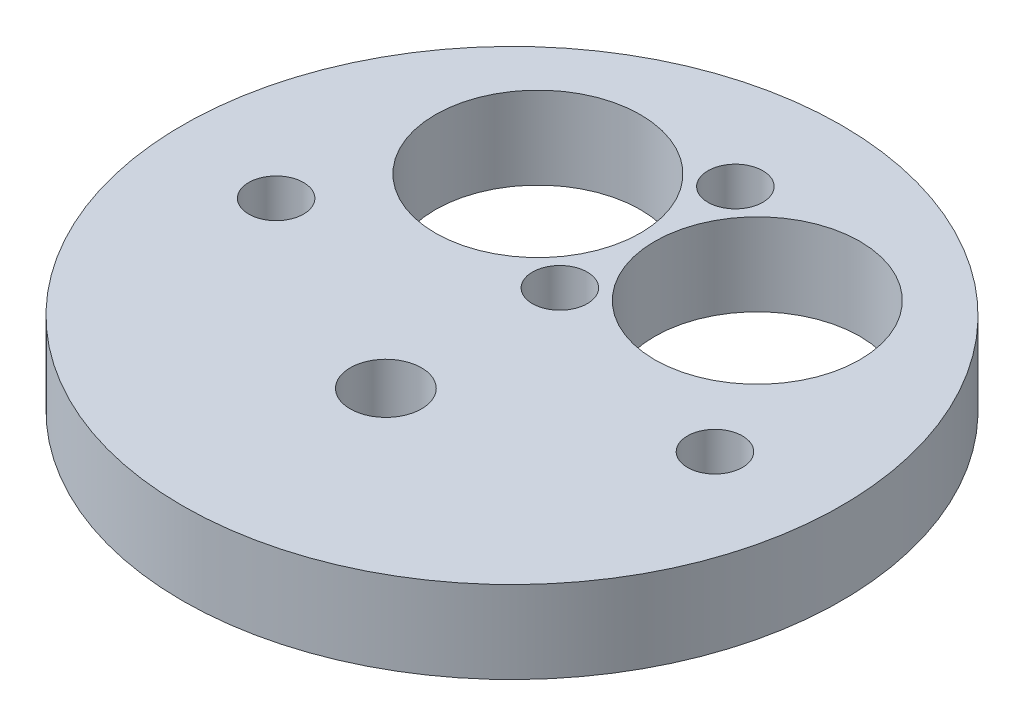
ISO-10303-21;
HEADER;
FILE_DESCRIPTION(('STEP AP214'),'2;1');
FILE_NAME('part.step','',(''),(''),'','','');
FILE_SCHEMA(('AUTOMOTIVE_DESIGN { 1 0 10303 214 1 1 1 1 }'));
ENDSEC;
DATA;
#1=APPLICATION_CONTEXT('core data for automotive mechanical design processes');
#2=APPLICATION_PROTOCOL_DEFINITION('international standard','automotive_design',2000,#1);
#3=PRODUCT_CONTEXT('',#1,'mechanical');
#4=PRODUCT('Part','Part','',(#3));
#5=PRODUCT_RELATED_PRODUCT_CATEGORY('part','',(#4));
#6=PRODUCT_DEFINITION_FORMATION('','',#4);
#7=PRODUCT_DEFINITION_CONTEXT('part definition',#1,'design');
#8=PRODUCT_DEFINITION('design','',#6,#7);
#9=PRODUCT_DEFINITION_SHAPE('','',#8);
#10=(LENGTH_UNIT() NAMED_UNIT(*) SI_UNIT(.MILLI.,.METRE.));
#11=(NAMED_UNIT(*) PLANE_ANGLE_UNIT() SI_UNIT($,.RADIAN.));
#12=(NAMED_UNIT(*) SI_UNIT($,.STERADIAN.) SOLID_ANGLE_UNIT());
#13=UNCERTAINTY_MEASURE_WITH_UNIT(LENGTH_MEASURE(1.E-05),#10,'distance_accuracy_value','');
#14=(GEOMETRIC_REPRESENTATION_CONTEXT(3) GLOBAL_UNCERTAINTY_ASSIGNED_CONTEXT((#13)) GLOBAL_UNIT_ASSIGNED_CONTEXT((#10,
#11,#12)) REPRESENTATION_CONTEXT('',''));
#15=CARTESIAN_POINT('',(0.,0.,0.));
#16=DIRECTION('',(0.,0.,1.));
#17=DIRECTION('',(1.,0.,0.));
#18=AXIS2_PLACEMENT_3D('',#15,#16,#17);
#19=CARTESIAN_POINT('',(0.,0.,0.));
#20=DIRECTION('',(0.,-1.,0.));
#21=DIRECTION('',(0.,0.,-1.));
#22=AXIS2_PLACEMENT_3D('',#19,#20,#21);
#23=PLANE('',#22);
#24=CARTESIAN_POINT('',(-25.4,0.,1.905));
#25=DIRECTION('',(0.,1.,0.));
#26=DIRECTION('',(0.,0.,1.));
#27=AXIS2_PLACEMENT_3D('',#24,#25,#26);
#28=CIRCLE('',#27,3.175);
#29=CARTESIAN_POINT('',(-25.4,0.,5.08));
#30=VERTEX_POINT('',#29);
#31=EDGE_CURVE('E119',#30,#30,#28,.T.);
#32=ORIENTED_EDGE('',*,*,#31,.T.);
#33=EDGE_LOOP('',(#32));
#34=FACE_BOUND('',#33,.T.);
#35=CARTESIAN_POINT('',(25.4,0.,1.90499999999999));
#36=DIRECTION('',(0.,1.,0.));
#37=DIRECTION('',(0.,0.,1.));
#38=AXIS2_PLACEMENT_3D('',#35,#36,#37);
#39=CIRCLE('',#38,3.175);
#40=CARTESIAN_POINT('',(25.4,0.,5.07999999999999));
#41=VERTEX_POINT('',#40);
#42=EDGE_CURVE('E123',#41,#41,#39,.T.);
#43=ORIENTED_EDGE('',*,*,#42,.T.);
#44=EDGE_LOOP('',(#43));
#45=FACE_BOUND('',#44,.T.);
#46=CARTESIAN_POINT('',(0.,0.,-25.85927542914));
#47=DIRECTION('',(0.,1.,0.));
#48=DIRECTION('',(0.,0.,1.));
#49=AXIS2_PLACEMENT_3D('',#46,#47,#48);
#50=CIRCLE('',#49,3.175);
#51=CARTESIAN_POINT('',(0.,0.,-22.68427542914));
#52=VERTEX_POINT('',#51);
#53=EDGE_CURVE('E136',#52,#52,#50,.T.);
#54=ORIENTED_EDGE('',*,*,#53,.T.);
#55=EDGE_LOOP('',(#54));
#56=FACE_BOUND('',#55,.T.);
#57=CARTESIAN_POINT('',(12.7,0.,-15.69927542914));
#58=DIRECTION('',(0.,1.,0.));
#59=DIRECTION('',(0.,0.,1.));
#60=AXIS2_PLACEMENT_3D('',#57,#58,#59);
#61=CIRCLE('',#60,11.8745);
#62=CARTESIAN_POINT('',(12.7,0.,-3.82477542914004));
#63=VERTEX_POINT('',#62);
#64=EDGE_CURVE('E141',#63,#63,#61,.T.);
#65=ORIENTED_EDGE('',*,*,#64,.T.);
#66=EDGE_LOOP('',(#65));
#67=FACE_BOUND('',#66,.T.);
#68=CARTESIAN_POINT('',(0.,0.,-5.53927542914004));
#69=DIRECTION('',(0.,1.,0.));
#70=DIRECTION('',(0.,0.,1.));
#71=AXIS2_PLACEMENT_3D('',#68,#69,#70);
#72=CIRCLE('',#71,3.175);
#73=CARTESIAN_POINT('',(0.,0.,-2.36427542914004));
#74=VERTEX_POINT('',#73);
#75=EDGE_CURVE('E133',#74,#74,#72,.T.);
#76=ORIENTED_EDGE('',*,*,#75,.T.);
#77=EDGE_LOOP('',(#76));
#78=FACE_BOUND('',#77,.T.);
#79=CARTESIAN_POINT('',(0.,0.,14.605));
#80=DIRECTION('',(0.,1.,0.));
#81=DIRECTION('',(0.,0.,1.));
#82=AXIS2_PLACEMENT_3D('',#79,#80,#81);
#83=CIRCLE('',#82,4.1275);
#84=CARTESIAN_POINT('',(0.,0.,18.7325));
#85=VERTEX_POINT('',#84);
#86=EDGE_CURVE('E125',#85,#85,#83,.T.);
#87=ORIENTED_EDGE('',*,*,#86,.T.);
#88=EDGE_LOOP('',(#87));
#89=FACE_BOUND('',#88,.T.);
#90=CARTESIAN_POINT('',(-12.7,0.,-15.69927542914));
#91=DIRECTION('',(0.,1.,0.));
#92=DIRECTION('',(0.,0.,1.));
#93=AXIS2_PLACEMENT_3D('',#90,#91,#92);
#94=CIRCLE('',#93,11.8745);
#95=CARTESIAN_POINT('',(-12.7,0.,-3.82477542914003));
#96=VERTEX_POINT('',#95);
#97=EDGE_CURVE('E53',#96,#96,#94,.T.);
#98=ORIENTED_EDGE('',*,*,#97,.T.);
#99=EDGE_LOOP('',(#98));
#100=FACE_BOUND('',#99,.T.);
#101=CARTESIAN_POINT('',(0.,0.,0.));
#102=DIRECTION('',(0.,-1.,0.));
#103=DIRECTION('',(0.,0.,-1.));
#104=AXIS2_PLACEMENT_3D('',#101,#102,#103);
#105=CIRCLE('',#104,38.1508);
#106=CARTESIAN_POINT('',(0.,0.,-38.1508));
#107=VERTEX_POINT('',#106);
#108=EDGE_CURVE('E10',#107,#107,#105,.T.);
#109=ORIENTED_EDGE('',*,*,#108,.T.);
#110=EDGE_LOOP('',(#109));
#111=FACE_BOUND('',#110,.T.);
#112=ADVANCED_FACE('F34',(#34,#45,#56,#67,#78,#89,#100,#111),#23,.T.);
#113=CARTESIAN_POINT('',(0.,0.,0.));
#114=DIRECTION('',(0.,-1.,0.));
#115=DIRECTION('',(0.,0.,-1.));
#116=AXIS2_PLACEMENT_3D('',#113,#114,#115);
#117=CYLINDRICAL_SURFACE('',#116,38.1508);
#118=CARTESIAN_POINT('',(0.,9.525,0.));
#119=DIRECTION('',(0.,-1.,0.));
#120=DIRECTION('',(0.,0.,-1.));
#121=AXIS2_PLACEMENT_3D('',#118,#119,#120);
#122=CIRCLE('',#121,38.1508);
#123=CARTESIAN_POINT('',(0.,9.525,-38.1508));
#124=VERTEX_POINT('',#123);
#125=EDGE_CURVE('E41',#124,#124,#122,.T.);
#126=ORIENTED_EDGE('',*,*,#125,.T.);
#127=EDGE_LOOP('',(#126));
#128=FACE_BOUND('',#127,.T.);
#129=ORIENTED_EDGE('',*,*,#108,.F.);
#130=EDGE_LOOP('',(#129));
#131=FACE_BOUND('',#130,.T.);
#132=ADVANCED_FACE('F72',(#128,#131),#117,.T.);
#133=CARTESIAN_POINT('',(38.1508,9.525,0.));
#134=DIRECTION('',(0.,1.,0.));
#135=DIRECTION('',(0.,0.,1.));
#136=AXIS2_PLACEMENT_3D('',#133,#134,#135);
#137=PLANE('',#136);
#138=CARTESIAN_POINT('',(-25.4,9.525,1.905));
#139=DIRECTION('',(0.,1.,0.));
#140=DIRECTION('',(0.,0.,1.));
#141=AXIS2_PLACEMENT_3D('',#138,#139,#140);
#142=CIRCLE('',#141,3.175);
#143=CARTESIAN_POINT('',(-25.4,9.52499999999999,5.08));
#144=VERTEX_POINT('',#143);
#145=EDGE_CURVE('E122',#144,#144,#142,.T.);
#146=ORIENTED_EDGE('',*,*,#145,.F.);
#147=EDGE_LOOP('',(#146));
#148=FACE_BOUND('',#147,.T.);
#149=CARTESIAN_POINT('',(25.4,9.525,1.90499999999999));
#150=DIRECTION('',(0.,1.,0.));
#151=DIRECTION('',(0.,0.,1.));
#152=AXIS2_PLACEMENT_3D('',#149,#150,#151);
#153=CIRCLE('',#152,3.175);
#154=CARTESIAN_POINT('',(25.4,9.52499999999999,5.07999999999999));
#155=VERTEX_POINT('',#154);
#156=EDGE_CURVE('E128',#155,#155,#153,.T.);
#157=ORIENTED_EDGE('',*,*,#156,.F.);
#158=EDGE_LOOP('',(#157));
#159=FACE_BOUND('',#158,.T.);
#160=CARTESIAN_POINT('',(0.,9.525,-25.85927542914));
#161=DIRECTION('',(0.,1.,0.));
#162=DIRECTION('',(0.,0.,1.));
#163=AXIS2_PLACEMENT_3D('',#160,#161,#162);
#164=CIRCLE('',#163,3.175);
#165=CARTESIAN_POINT('',(0.,9.52499999999999,-22.68427542914));
#166=VERTEX_POINT('',#165);
#167=EDGE_CURVE('E37',#166,#166,#164,.T.);
#168=ORIENTED_EDGE('',*,*,#167,.F.);
#169=EDGE_LOOP('',(#168));
#170=FACE_BOUND('',#169,.T.);
#171=CARTESIAN_POINT('',(12.7,9.525,-15.69927542914));
#172=DIRECTION('',(0.,1.,0.));
#173=DIRECTION('',(0.,0.,1.));
#174=AXIS2_PLACEMENT_3D('',#171,#172,#173);
#175=CIRCLE('',#174,11.8745);
#176=CARTESIAN_POINT('',(12.7,9.52499999999999,-3.82477542914004));
#177=VERTEX_POINT('',#176);
#178=EDGE_CURVE('E58',#177,#177,#175,.T.);
#179=ORIENTED_EDGE('',*,*,#178,.F.);
#180=EDGE_LOOP('',(#179));
#181=FACE_BOUND('',#180,.T.);
#182=CARTESIAN_POINT('',(0.,9.525,-5.53927542914004));
#183=DIRECTION('',(0.,1.,0.));
#184=DIRECTION('',(0.,0.,1.));
#185=AXIS2_PLACEMENT_3D('',#182,#183,#184);
#186=CIRCLE('',#185,3.175);
#187=CARTESIAN_POINT('',(0.,9.52499999999999,-2.36427542914004));
#188=VERTEX_POINT('',#187);
#189=EDGE_CURVE('E56',#188,#188,#186,.T.);
#190=ORIENTED_EDGE('',*,*,#189,.F.);
#191=EDGE_LOOP('',(#190));
#192=FACE_BOUND('',#191,.T.);
#193=CARTESIAN_POINT('',(0.,9.525,14.605));
#194=DIRECTION('',(0.,1.,0.));
#195=DIRECTION('',(0.,0.,1.));
#196=AXIS2_PLACEMENT_3D('',#193,#194,#195);
#197=CIRCLE('',#196,4.1275);
#198=CARTESIAN_POINT('',(0.,9.52499999999999,18.7325));
#199=VERTEX_POINT('',#198);
#200=EDGE_CURVE('E52',#199,#199,#197,.T.);
#201=ORIENTED_EDGE('',*,*,#200,.F.);
#202=EDGE_LOOP('',(#201));
#203=FACE_BOUND('',#202,.T.);
#204=CARTESIAN_POINT('',(-12.7,9.525,-15.69927542914));
#205=DIRECTION('',(0.,1.,0.));
#206=DIRECTION('',(0.,0.,1.));
#207=AXIS2_PLACEMENT_3D('',#204,#205,#206);
#208=CIRCLE('',#207,11.8745);
#209=CARTESIAN_POINT('',(-12.7,9.52499999999999,-3.82477542914003));
#210=VERTEX_POINT('',#209);
#211=EDGE_CURVE('E49',#210,#210,#208,.T.);
#212=ORIENTED_EDGE('',*,*,#211,.F.);
#213=EDGE_LOOP('',(#212));
#214=FACE_BOUND('',#213,.T.);
#215=ORIENTED_EDGE('',*,*,#125,.F.);
#216=EDGE_LOOP('',(#215));
#217=FACE_BOUND('',#216,.T.);
#218=ADVANCED_FACE('F68',(#148,#159,#170,#181,#192,#203,#214,#217),#137,.T.);
#219=CARTESIAN_POINT('',(-12.7,0.,-15.69927542914));
#220=DIRECTION('',(0.,1.,0.));
#221=DIRECTION('',(0.,0.,1.));
#222=AXIS2_PLACEMENT_3D('',#219,#220,#221);
#223=CYLINDRICAL_SURFACE('',#222,11.8745);
#224=CARTESIAN_POINT('',(-12.7,9.52499999999999,-3.82477542914003));
#225=CARTESIAN_POINT('',(-12.7,9.42578124999999,-3.82477542914003));
#226=CARTESIAN_POINT('',(-12.7,9.32656249999999,-3.82477542914003));
#227=CARTESIAN_POINT('',(-12.7,9.12812499999999,-3.82477542914003));
#228=CARTESIAN_POINT('',(-12.7,9.02890624999999,-3.82477542914003));
#229=CARTESIAN_POINT('',(-12.7,8.83046874999999,-3.82477542914003));
#230=CARTESIAN_POINT('',(-12.7,8.73124999999999,-3.82477542914003));
#231=CARTESIAN_POINT('',(-12.7,8.5328125,-3.82477542914003));
#232=CARTESIAN_POINT('',(-12.7,8.43359374999999,-3.82477542914003));
#233=CARTESIAN_POINT('',(-12.7,8.23515625,-3.82477542914003));
#234=CARTESIAN_POINT('',(-12.7,8.13593749999999,-3.82477542914003));
#235=CARTESIAN_POINT('',(-12.7,7.93749999999999,-3.82477542914003));
#236=CARTESIAN_POINT('',(-12.7,7.83828125,-3.82477542914003));
#237=CARTESIAN_POINT('',(-12.7,7.63984374999999,-3.82477542914003));
#238=CARTESIAN_POINT('',(-12.7,7.540625,-3.82477542914003));
#239=CARTESIAN_POINT('',(-12.7,7.3421875,-3.82477542914003));
#240=CARTESIAN_POINT('',(-12.7,7.24296874999999,-3.82477542914003));
#241=CARTESIAN_POINT('',(-12.7,7.04453125,-3.82477542914003));
#242=CARTESIAN_POINT('',(-12.7,6.9453125,-3.82477542914003));
#243=CARTESIAN_POINT('',(-12.7,6.746875,-3.82477542914003));
#244=CARTESIAN_POINT('',(-12.7,6.64765625,-3.82477542914003));
#245=CARTESIAN_POINT('',(-12.7,6.44921875,-3.82477542914003));
#246=CARTESIAN_POINT('',(-12.7,6.35,-3.82477542914003));
#247=CARTESIAN_POINT('',(-12.7,6.1515625,-3.82477542914003));
#248=CARTESIAN_POINT('',(-12.7,6.05234375,-3.82477542914003));
#249=CARTESIAN_POINT('',(-12.7,5.85390625,-3.82477542914003));
#250=CARTESIAN_POINT('',(-12.7,5.7546875,-3.82477542914003));
#251=CARTESIAN_POINT('',(-12.7,5.55625,-3.82477542914003));
#252=CARTESIAN_POINT('',(-12.7,5.45703125,-3.82477542914003));
#253=CARTESIAN_POINT('',(-12.7,5.25859375,-3.82477542914003));
#254=CARTESIAN_POINT('',(-12.7,5.159375,-3.82477542914003));
#255=CARTESIAN_POINT('',(-12.7,4.9609375,-3.82477542914003));
#256=CARTESIAN_POINT('',(-12.7,4.86171875,-3.82477542914003));
#257=CARTESIAN_POINT('',(-12.7,4.66328125,-3.82477542914003));
#258=CARTESIAN_POINT('',(-12.7,4.5640625,-3.82477542914003));
#259=CARTESIAN_POINT('',(-12.7,4.365625,-3.82477542914003));
#260=CARTESIAN_POINT('',(-12.7,4.26640625,-3.82477542914003));
#261=CARTESIAN_POINT('',(-12.7,4.06796875,-3.82477542914003));
#262=CARTESIAN_POINT('',(-12.7,3.96875,-3.82477542914003));
#263=CARTESIAN_POINT('',(-12.7,3.7703125,-3.82477542914003));
#264=CARTESIAN_POINT('',(-12.7,3.67109375,-3.82477542914003));
#265=CARTESIAN_POINT('',(-12.7,3.47265625,-3.82477542914003));
#266=CARTESIAN_POINT('',(-12.7,3.3734375,-3.82477542914003));
#267=CARTESIAN_POINT('',(-12.7,3.175,-3.82477542914003));
#268=CARTESIAN_POINT('',(-12.7,3.07578125,-3.82477542914003));
#269=CARTESIAN_POINT('',(-12.7,2.87734375,-3.82477542914003));
#270=CARTESIAN_POINT('',(-12.7,2.778125,-3.82477542914003));
#271=CARTESIAN_POINT('',(-12.7,2.5796875,-3.82477542914003));
#272=CARTESIAN_POINT('',(-12.7,2.48046875,-3.82477542914003));
#273=CARTESIAN_POINT('',(-12.7,2.28203125,-3.82477542914003));
#274=CARTESIAN_POINT('',(-12.7,2.1828125,-3.82477542914003));
#275=CARTESIAN_POINT('',(-12.7,1.984375,-3.82477542914003));
#276=CARTESIAN_POINT('',(-12.7,1.88515625,-3.82477542914003));
#277=CARTESIAN_POINT('',(-12.7,1.68671875,-3.82477542914003));
#278=CARTESIAN_POINT('',(-12.7,1.5875,-3.82477542914003));
#279=CARTESIAN_POINT('',(-12.7,1.3890625,-3.82477542914003));
#280=CARTESIAN_POINT('',(-12.7,1.28984375,-3.82477542914003));
#281=CARTESIAN_POINT('',(-12.7,1.09140625,-3.82477542914003));
#282=CARTESIAN_POINT('',(-12.7,0.992187499999999,-3.82477542914003));
#283=CARTESIAN_POINT('',(-12.7,0.793749999999999,-3.82477542914003));
#284=CARTESIAN_POINT('',(-12.7,0.69453125,-3.82477542914003));
#285=CARTESIAN_POINT('',(-12.7,0.49609375,-3.82477542914003));
#286=CARTESIAN_POINT('',(-12.7,0.396875,-3.82477542914003));
#287=CARTESIAN_POINT('',(-12.7,0.1984375,-3.82477542914003));
#288=CARTESIAN_POINT('',(-12.7,0.09921875,-3.82477542914003));
#289=CARTESIAN_POINT('',(-12.7,0.,-3.82477542914003));
#290=B_SPLINE_CURVE_WITH_KNOTS('',3,(#224,#225,#226,#227,#228,#229,#230,#231,#232,#233,#234,
#235,#236,#237,#238,#239,#240,#241,#242,#243,#244,#245,#246,#247,#248,#249,#250,#251,#252,#253,
#254,#255,#256,#257,#258,#259,#260,#261,#262,#263,#264,#265,#266,#267,#268,#269,#270,#271,#272,
#273,#274,#275,#276,#277,#278,#279,#280,#281,#282,#283,#284,#285,#286,#287,#288,#289),
.UNSPECIFIED.,.F.,.F.,(4,2,2,2,2,2,2,2,2,2,2,2,2,2,2,2,2,2,2,2,2,2,2,2,2,2,2,2,2,2,2,2,4),(0.,
0.29765625,0.5953125,0.892968749999999,1.190625,1.48828125,1.7859375,2.08359375,2.38125,
2.67890625,2.9765625,3.27421875,3.571875,3.86953125,4.1671875,4.46484375,4.7625,5.06015625,
5.3578125,5.65546875,5.953125,6.25078125,6.5484375,6.84609375,7.14375,7.44140625,
7.73906249999999,8.03671875,8.33437499999999,8.63203125,8.92968749999999,9.22734374999999,
9.52499999999999),.UNSPECIFIED.);
#291=EDGE_CURVE('BSEAM71',#210,#96,#290,.T.);
#292=ORIENTED_EDGE('',*,*,#211,.T.);
#293=ORIENTED_EDGE('',*,*,#97,.F.);
#294=ORIENTED_EDGE('',*,*,#291,.T.);
#295=ORIENTED_EDGE('',*,*,#291,.F.);
#296=EDGE_LOOP('',(#292,#294,#293,#295));
#297=FACE_BOUND('',#296,.T.);
#298=ADVANCED_FACE('F71',(#297),#223,.F.);
#299=CARTESIAN_POINT('',(0.,0.,14.605));
#300=DIRECTION('',(0.,1.,0.));
#301=DIRECTION('',(0.,0.,1.));
#302=AXIS2_PLACEMENT_3D('',#299,#300,#301);
#303=CYLINDRICAL_SURFACE('',#302,4.1275);
#304=CARTESIAN_POINT('',(0.,9.52499999999999,18.7325));
#305=CARTESIAN_POINT('',(0.,9.42578124999999,18.7325));
#306=CARTESIAN_POINT('',(0.,9.32656249999999,18.7325));
#307=CARTESIAN_POINT('',(0.,9.12812499999999,18.7325));
#308=CARTESIAN_POINT('',(0.,9.02890624999999,18.7325));
#309=CARTESIAN_POINT('',(0.,8.83046874999999,18.7325));
#310=CARTESIAN_POINT('',(0.,8.73124999999999,18.7325));
#311=CARTESIAN_POINT('',(0.,8.5328125,18.7325));
#312=CARTESIAN_POINT('',(0.,8.43359374999999,18.7325));
#313=CARTESIAN_POINT('',(0.,8.23515625,18.7325));
#314=CARTESIAN_POINT('',(0.,8.13593749999999,18.7325));
#315=CARTESIAN_POINT('',(0.,7.93749999999999,18.7325));
#316=CARTESIAN_POINT('',(0.,7.83828125,18.7325));
#317=CARTESIAN_POINT('',(0.,7.63984374999999,18.7325));
#318=CARTESIAN_POINT('',(0.,7.540625,18.7325));
#319=CARTESIAN_POINT('',(0.,7.3421875,18.7325));
#320=CARTESIAN_POINT('',(0.,7.24296874999999,18.7325));
#321=CARTESIAN_POINT('',(0.,7.04453125,18.7325));
#322=CARTESIAN_POINT('',(0.,6.9453125,18.7325));
#323=CARTESIAN_POINT('',(0.,6.746875,18.7325));
#324=CARTESIAN_POINT('',(0.,6.64765625,18.7325));
#325=CARTESIAN_POINT('',(0.,6.44921875,18.7325));
#326=CARTESIAN_POINT('',(0.,6.35,18.7325));
#327=CARTESIAN_POINT('',(0.,6.1515625,18.7325));
#328=CARTESIAN_POINT('',(0.,6.05234375,18.7325));
#329=CARTESIAN_POINT('',(0.,5.85390625,18.7325));
#330=CARTESIAN_POINT('',(0.,5.7546875,18.7325));
#331=CARTESIAN_POINT('',(0.,5.55625,18.7325));
#332=CARTESIAN_POINT('',(0.,5.45703125,18.7325));
#333=CARTESIAN_POINT('',(0.,5.25859375,18.7325));
#334=CARTESIAN_POINT('',(0.,5.159375,18.7325));
#335=CARTESIAN_POINT('',(0.,4.9609375,18.7325));
#336=CARTESIAN_POINT('',(0.,4.86171875,18.7325));
#337=CARTESIAN_POINT('',(0.,4.66328125,18.7325));
#338=CARTESIAN_POINT('',(0.,4.5640625,18.7325));
#339=CARTESIAN_POINT('',(0.,4.365625,18.7325));
#340=CARTESIAN_POINT('',(0.,4.26640625,18.7325));
#341=CARTESIAN_POINT('',(0.,4.06796875,18.7325));
#342=CARTESIAN_POINT('',(0.,3.96875,18.7325));
#343=CARTESIAN_POINT('',(0.,3.7703125,18.7325));
#344=CARTESIAN_POINT('',(0.,3.67109375,18.7325));
#345=CARTESIAN_POINT('',(0.,3.47265625,18.7325));
#346=CARTESIAN_POINT('',(0.,3.3734375,18.7325));
#347=CARTESIAN_POINT('',(0.,3.175,18.7325));
#348=CARTESIAN_POINT('',(0.,3.07578125,18.7325));
#349=CARTESIAN_POINT('',(0.,2.87734375,18.7325));
#350=CARTESIAN_POINT('',(0.,2.778125,18.7325));
#351=CARTESIAN_POINT('',(0.,2.5796875,18.7325));
#352=CARTESIAN_POINT('',(0.,2.48046875,18.7325));
#353=CARTESIAN_POINT('',(0.,2.28203125,18.7325));
#354=CARTESIAN_POINT('',(0.,2.1828125,18.7325));
#355=CARTESIAN_POINT('',(0.,1.984375,18.7325));
#356=CARTESIAN_POINT('',(0.,1.88515625,18.7325));
#357=CARTESIAN_POINT('',(0.,1.68671875,18.7325));
#358=CARTESIAN_POINT('',(0.,1.5875,18.7325));
#359=CARTESIAN_POINT('',(0.,1.3890625,18.7325));
#360=CARTESIAN_POINT('',(0.,1.28984375,18.7325));
#361=CARTESIAN_POINT('',(0.,1.09140625,18.7325));
#362=CARTESIAN_POINT('',(0.,0.992187499999999,18.7325));
#363=CARTESIAN_POINT('',(0.,0.793749999999999,18.7325));
#364=CARTESIAN_POINT('',(0.,0.69453125,18.7325));
#365=CARTESIAN_POINT('',(0.,0.49609375,18.7325));
#366=CARTESIAN_POINT('',(0.,0.396875,18.7325));
#367=CARTESIAN_POINT('',(0.,0.1984375,18.7325));
#368=CARTESIAN_POINT('',(0.,0.09921875,18.7325));
#369=CARTESIAN_POINT('',(0.,0.,18.7325));
#370=B_SPLINE_CURVE_WITH_KNOTS('',3,(#304,#305,#306,#307,#308,#309,#310,#311,#312,#313,#314,
#315,#316,#317,#318,#319,#320,#321,#322,#323,#324,#325,#326,#327,#328,#329,#330,#331,#332,#333,
#334,#335,#336,#337,#338,#339,#340,#341,#342,#343,#344,#345,#346,#347,#348,#349,#350,#351,#352,
#353,#354,#355,#356,#357,#358,#359,#360,#361,#362,#363,#364,#365,#366,#367,#368,#369),
.UNSPECIFIED.,.F.,.F.,(4,2,2,2,2,2,2,2,2,2,2,2,2,2,2,2,2,2,2,2,2,2,2,2,2,2,2,2,2,2,2,2,4),(0.,
0.29765625,0.5953125,0.892968749999999,1.190625,1.48828125,1.7859375,2.08359375,2.38125,
2.67890625,2.9765625,3.27421875,3.571875,3.86953125,4.1671875,4.46484375,4.7625,5.06015625,
5.3578125,5.65546875,5.953125,6.25078125,6.5484375,6.84609375,7.14375,7.44140625,
7.73906249999999,8.03671875,8.33437499999999,8.63203125,8.92968749999999,9.22734374999999,
9.52499999999999),.UNSPECIFIED.);
#371=EDGE_CURVE('BSEAM93',#199,#85,#370,.T.);
#372=ORIENTED_EDGE('',*,*,#200,.T.);
#373=ORIENTED_EDGE('',*,*,#86,.F.);
#374=ORIENTED_EDGE('',*,*,#371,.T.);
#375=ORIENTED_EDGE('',*,*,#371,.F.);
#376=EDGE_LOOP('',(#372,#374,#373,#375));
#377=FACE_BOUND('',#376,.T.);
#378=ADVANCED_FACE('F93',(#377),#303,.F.);
#379=CARTESIAN_POINT('',(0.,0.,-5.53927542914004));
#380=DIRECTION('',(0.,1.,0.));
#381=DIRECTION('',(0.,0.,1.));
#382=AXIS2_PLACEMENT_3D('',#379,#380,#381);
#383=CYLINDRICAL_SURFACE('',#382,3.175);
#384=CARTESIAN_POINT('',(0.,9.52499999999999,-2.36427542914004));
#385=CARTESIAN_POINT('',(0.,9.42578124999999,-2.36427542914004));
#386=CARTESIAN_POINT('',(0.,9.32656249999999,-2.36427542914004));
#387=CARTESIAN_POINT('',(0.,9.12812499999999,-2.36427542914004));
#388=CARTESIAN_POINT('',(0.,9.02890624999999,-2.36427542914004));
#389=CARTESIAN_POINT('',(0.,8.83046874999999,-2.36427542914004));
#390=CARTESIAN_POINT('',(0.,8.73124999999999,-2.36427542914004));
#391=CARTESIAN_POINT('',(0.,8.5328125,-2.36427542914004));
#392=CARTESIAN_POINT('',(0.,8.43359374999999,-2.36427542914004));
#393=CARTESIAN_POINT('',(0.,8.23515625,-2.36427542914004));
#394=CARTESIAN_POINT('',(0.,8.13593749999999,-2.36427542914004));
#395=CARTESIAN_POINT('',(0.,7.93749999999999,-2.36427542914004));
#396=CARTESIAN_POINT('',(0.,7.83828125,-2.36427542914004));
#397=CARTESIAN_POINT('',(0.,7.63984374999999,-2.36427542914004));
#398=CARTESIAN_POINT('',(0.,7.540625,-2.36427542914004));
#399=CARTESIAN_POINT('',(0.,7.3421875,-2.36427542914004));
#400=CARTESIAN_POINT('',(0.,7.24296874999999,-2.36427542914004));
#401=CARTESIAN_POINT('',(0.,7.04453125,-2.36427542914004));
#402=CARTESIAN_POINT('',(0.,6.9453125,-2.36427542914004));
#403=CARTESIAN_POINT('',(0.,6.746875,-2.36427542914004));
#404=CARTESIAN_POINT('',(0.,6.64765625,-2.36427542914004));
#405=CARTESIAN_POINT('',(0.,6.44921875,-2.36427542914004));
#406=CARTESIAN_POINT('',(0.,6.35,-2.36427542914004));
#407=CARTESIAN_POINT('',(0.,6.1515625,-2.36427542914004));
#408=CARTESIAN_POINT('',(0.,6.05234375,-2.36427542914004));
#409=CARTESIAN_POINT('',(0.,5.85390625,-2.36427542914004));
#410=CARTESIAN_POINT('',(0.,5.7546875,-2.36427542914004));
#411=CARTESIAN_POINT('',(0.,5.55625,-2.36427542914004));
#412=CARTESIAN_POINT('',(0.,5.45703125,-2.36427542914004));
#413=CARTESIAN_POINT('',(0.,5.25859375,-2.36427542914004));
#414=CARTESIAN_POINT('',(0.,5.159375,-2.36427542914004));
#415=CARTESIAN_POINT('',(0.,4.9609375,-2.36427542914004));
#416=CARTESIAN_POINT('',(0.,4.86171875,-2.36427542914004));
#417=CARTESIAN_POINT('',(0.,4.66328125,-2.36427542914004));
#418=CARTESIAN_POINT('',(0.,4.5640625,-2.36427542914004));
#419=CARTESIAN_POINT('',(0.,4.365625,-2.36427542914004));
#420=CARTESIAN_POINT('',(0.,4.26640625,-2.36427542914004));
#421=CARTESIAN_POINT('',(0.,4.06796875,-2.36427542914004));
#422=CARTESIAN_POINT('',(0.,3.96875,-2.36427542914004));
#423=CARTESIAN_POINT('',(0.,3.7703125,-2.36427542914004));
#424=CARTESIAN_POINT('',(0.,3.67109375,-2.36427542914004));
#425=CARTESIAN_POINT('',(0.,3.47265625,-2.36427542914004));
#426=CARTESIAN_POINT('',(0.,3.3734375,-2.36427542914004));
#427=CARTESIAN_POINT('',(0.,3.175,-2.36427542914004));
#428=CARTESIAN_POINT('',(0.,3.07578125,-2.36427542914004));
#429=CARTESIAN_POINT('',(0.,2.87734375,-2.36427542914004));
#430=CARTESIAN_POINT('',(0.,2.778125,-2.36427542914004));
#431=CARTESIAN_POINT('',(0.,2.5796875,-2.36427542914004));
#432=CARTESIAN_POINT('',(0.,2.48046875,-2.36427542914004));
#433=CARTESIAN_POINT('',(0.,2.28203125,-2.36427542914004));
#434=CARTESIAN_POINT('',(0.,2.1828125,-2.36427542914004));
#435=CARTESIAN_POINT('',(0.,1.984375,-2.36427542914004));
#436=CARTESIAN_POINT('',(0.,1.88515625,-2.36427542914004));
#437=CARTESIAN_POINT('',(0.,1.68671875,-2.36427542914004));
#438=CARTESIAN_POINT('',(0.,1.5875,-2.36427542914004));
#439=CARTESIAN_POINT('',(0.,1.3890625,-2.36427542914004));
#440=CARTESIAN_POINT('',(0.,1.28984375,-2.36427542914004));
#441=CARTESIAN_POINT('',(0.,1.09140625,-2.36427542914004));
#442=CARTESIAN_POINT('',(0.,0.992187499999999,-2.36427542914004));
#443=CARTESIAN_POINT('',(0.,0.793749999999999,-2.36427542914004));
#444=CARTESIAN_POINT('',(0.,0.69453125,-2.36427542914004));
#445=CARTESIAN_POINT('',(0.,0.49609375,-2.36427542914004));
#446=CARTESIAN_POINT('',(0.,0.396875,-2.36427542914004));
#447=CARTESIAN_POINT('',(0.,0.1984375,-2.36427542914004));
#448=CARTESIAN_POINT('',(0.,0.09921875,-2.36427542914004));
#449=CARTESIAN_POINT('',(0.,0.,-2.36427542914004));
#450=B_SPLINE_CURVE_WITH_KNOTS('',3,(#384,#385,#386,#387,#388,#389,#390,#391,#392,#393,#394,
#395,#396,#397,#398,#399,#400,#401,#402,#403,#404,#405,#406,#407,#408,#409,#410,#411,#412,#413,
#414,#415,#416,#417,#418,#419,#420,#421,#422,#423,#424,#425,#426,#427,#428,#429,#430,#431,#432,
#433,#434,#435,#436,#437,#438,#439,#440,#441,#442,#443,#444,#445,#446,#447,#448,#449),
.UNSPECIFIED.,.F.,.F.,(4,2,2,2,2,2,2,2,2,2,2,2,2,2,2,2,2,2,2,2,2,2,2,2,2,2,2,2,2,2,2,2,4),(0.,
0.29765625,0.5953125,0.892968749999999,1.190625,1.48828125,1.7859375,2.08359375,2.38125,
2.67890625,2.9765625,3.27421875,3.571875,3.86953125,4.1671875,4.46484375,4.7625,5.06015625,
5.3578125,5.65546875,5.953125,6.25078125,6.5484375,6.84609375,7.14375,7.44140625,
7.73906249999999,8.03671875,8.33437499999999,8.63203125,8.92968749999999,9.22734374999999,
9.52499999999999),.UNSPECIFIED.);
#451=EDGE_CURVE('BSEAM98',#188,#74,#450,.T.);
#452=ORIENTED_EDGE('',*,*,#189,.T.);
#453=ORIENTED_EDGE('',*,*,#75,.F.);
#454=ORIENTED_EDGE('',*,*,#451,.T.);
#455=ORIENTED_EDGE('',*,*,#451,.F.);
#456=EDGE_LOOP('',(#452,#454,#453,#455));
#457=FACE_BOUND('',#456,.T.);
#458=ADVANCED_FACE('F98',(#457),#383,.F.);
#459=CARTESIAN_POINT('',(12.7,0.,-15.69927542914));
#460=DIRECTION('',(0.,1.,0.));
#461=DIRECTION('',(0.,0.,1.));
#462=AXIS2_PLACEMENT_3D('',#459,#460,#461);
#463=CYLINDRICAL_SURFACE('',#462,11.8745);
#464=CARTESIAN_POINT('',(12.7,9.52499999999999,-3.82477542914004));
#465=CARTESIAN_POINT('',(12.7,9.42578124999999,-3.82477542914004));
#466=CARTESIAN_POINT('',(12.7,9.32656249999999,-3.82477542914004));
#467=CARTESIAN_POINT('',(12.7,9.12812499999999,-3.82477542914004));
#468=CARTESIAN_POINT('',(12.7,9.02890624999999,-3.82477542914004));
#469=CARTESIAN_POINT('',(12.7,8.83046874999999,-3.82477542914004));
#470=CARTESIAN_POINT('',(12.7,8.73124999999999,-3.82477542914004));
#471=CARTESIAN_POINT('',(12.7,8.5328125,-3.82477542914004));
#472=CARTESIAN_POINT('',(12.7,8.43359374999999,-3.82477542914004));
#473=CARTESIAN_POINT('',(12.7,8.23515625,-3.82477542914004));
#474=CARTESIAN_POINT('',(12.7,8.13593749999999,-3.82477542914004));
#475=CARTESIAN_POINT('',(12.7,7.93749999999999,-3.82477542914004));
#476=CARTESIAN_POINT('',(12.7,7.83828125,-3.82477542914004));
#477=CARTESIAN_POINT('',(12.7,7.63984374999999,-3.82477542914004));
#478=CARTESIAN_POINT('',(12.7,7.540625,-3.82477542914004));
#479=CARTESIAN_POINT('',(12.7,7.3421875,-3.82477542914004));
#480=CARTESIAN_POINT('',(12.7,7.24296874999999,-3.82477542914004));
#481=CARTESIAN_POINT('',(12.7,7.04453125,-3.82477542914004));
#482=CARTESIAN_POINT('',(12.7,6.9453125,-3.82477542914004));
#483=CARTESIAN_POINT('',(12.7,6.746875,-3.82477542914004));
#484=CARTESIAN_POINT('',(12.7,6.64765625,-3.82477542914004));
#485=CARTESIAN_POINT('',(12.7,6.44921875,-3.82477542914004));
#486=CARTESIAN_POINT('',(12.7,6.35,-3.82477542914004));
#487=CARTESIAN_POINT('',(12.7,6.1515625,-3.82477542914004));
#488=CARTESIAN_POINT('',(12.7,6.05234375,-3.82477542914004));
#489=CARTESIAN_POINT('',(12.7,5.85390625,-3.82477542914004));
#490=CARTESIAN_POINT('',(12.7,5.7546875,-3.82477542914004));
#491=CARTESIAN_POINT('',(12.7,5.55625,-3.82477542914004));
#492=CARTESIAN_POINT('',(12.7,5.45703125,-3.82477542914004));
#493=CARTESIAN_POINT('',(12.7,5.25859375,-3.82477542914004));
#494=CARTESIAN_POINT('',(12.7,5.159375,-3.82477542914004));
#495=CARTESIAN_POINT('',(12.7,4.9609375,-3.82477542914004));
#496=CARTESIAN_POINT('',(12.7,4.86171875,-3.82477542914004));
#497=CARTESIAN_POINT('',(12.7,4.66328125,-3.82477542914004));
#498=CARTESIAN_POINT('',(12.7,4.5640625,-3.82477542914004));
#499=CARTESIAN_POINT('',(12.7,4.365625,-3.82477542914004));
#500=CARTESIAN_POINT('',(12.7,4.26640625,-3.82477542914004));
#501=CARTESIAN_POINT('',(12.7,4.06796875,-3.82477542914004));
#502=CARTESIAN_POINT('',(12.7,3.96875,-3.82477542914004));
#503=CARTESIAN_POINT('',(12.7,3.7703125,-3.82477542914004));
#504=CARTESIAN_POINT('',(12.7,3.67109375,-3.82477542914004));
#505=CARTESIAN_POINT('',(12.7,3.47265625,-3.82477542914004));
#506=CARTESIAN_POINT('',(12.7,3.3734375,-3.82477542914004));
#507=CARTESIAN_POINT('',(12.7,3.175,-3.82477542914004));
#508=CARTESIAN_POINT('',(12.7,3.07578125,-3.82477542914004));
#509=CARTESIAN_POINT('',(12.7,2.87734375,-3.82477542914004));
#510=CARTESIAN_POINT('',(12.7,2.778125,-3.82477542914004));
#511=CARTESIAN_POINT('',(12.7,2.5796875,-3.82477542914004));
#512=CARTESIAN_POINT('',(12.7,2.48046875,-3.82477542914004));
#513=CARTESIAN_POINT('',(12.7,2.28203125,-3.82477542914004));
#514=CARTESIAN_POINT('',(12.7,2.1828125,-3.82477542914004));
#515=CARTESIAN_POINT('',(12.7,1.984375,-3.82477542914004));
#516=CARTESIAN_POINT('',(12.7,1.88515625,-3.82477542914004));
#517=CARTESIAN_POINT('',(12.7,1.68671875,-3.82477542914004));
#518=CARTESIAN_POINT('',(12.7,1.5875,-3.82477542914004));
#519=CARTESIAN_POINT('',(12.7,1.3890625,-3.82477542914004));
#520=CARTESIAN_POINT('',(12.7,1.28984375,-3.82477542914004));
#521=CARTESIAN_POINT('',(12.7,1.09140625,-3.82477542914004));
#522=CARTESIAN_POINT('',(12.7,0.992187499999999,-3.82477542914004));
#523=CARTESIAN_POINT('',(12.7,0.793749999999999,-3.82477542914004));
#524=CARTESIAN_POINT('',(12.7,0.69453125,-3.82477542914004));
#525=CARTESIAN_POINT('',(12.7,0.49609375,-3.82477542914004));
#526=CARTESIAN_POINT('',(12.7,0.396875,-3.82477542914004));
#527=CARTESIAN_POINT('',(12.7,0.1984375,-3.82477542914004));
#528=CARTESIAN_POINT('',(12.7,0.09921875,-3.82477542914004));
#529=CARTESIAN_POINT('',(12.7,0.,-3.82477542914004));
#530=B_SPLINE_CURVE_WITH_KNOTS('',3,(#464,#465,#466,#467,#468,#469,#470,#471,#472,#473,#474,
#475,#476,#477,#478,#479,#480,#481,#482,#483,#484,#485,#486,#487,#488,#489,#490,#491,#492,#493,
#494,#495,#496,#497,#498,#499,#500,#501,#502,#503,#504,#505,#506,#507,#508,#509,#510,#511,#512,
#513,#514,#515,#516,#517,#518,#519,#520,#521,#522,#523,#524,#525,#526,#527,#528,#529),
.UNSPECIFIED.,.F.,.F.,(4,2,2,2,2,2,2,2,2,2,2,2,2,2,2,2,2,2,2,2,2,2,2,2,2,2,2,2,2,2,2,2,4),(0.,
0.29765625,0.5953125,0.892968749999999,1.190625,1.48828125,1.7859375,2.08359375,2.38125,
2.67890625,2.9765625,3.27421875,3.571875,3.86953125,4.1671875,4.46484375,4.7625,5.06015625,
5.3578125,5.65546875,5.953125,6.25078125,6.5484375,6.84609375,7.14375,7.44140625,
7.73906249999999,8.03671875,8.33437499999999,8.63203125,8.92968749999999,9.22734374999999,
9.52499999999999),.UNSPECIFIED.);
#531=EDGE_CURVE('BSEAM95',#177,#63,#530,.T.);
#532=ORIENTED_EDGE('',*,*,#178,.T.);
#533=ORIENTED_EDGE('',*,*,#64,.F.);
#534=ORIENTED_EDGE('',*,*,#531,.T.);
#535=ORIENTED_EDGE('',*,*,#531,.F.);
#536=EDGE_LOOP('',(#532,#534,#533,#535));
#537=FACE_BOUND('',#536,.T.);
#538=ADVANCED_FACE('F95',(#537),#463,.F.);
#539=CARTESIAN_POINT('',(0.,0.,-25.85927542914));
#540=DIRECTION('',(0.,1.,0.));
#541=DIRECTION('',(0.,0.,1.));
#542=AXIS2_PLACEMENT_3D('',#539,#540,#541);
#543=CYLINDRICAL_SURFACE('',#542,3.175);
#544=CARTESIAN_POINT('',(0.,9.52499999999999,-22.68427542914));
#545=CARTESIAN_POINT('',(0.,9.42578124999999,-22.68427542914));
#546=CARTESIAN_POINT('',(0.,9.32656249999999,-22.68427542914));
#547=CARTESIAN_POINT('',(0.,9.12812499999999,-22.68427542914));
#548=CARTESIAN_POINT('',(0.,9.02890624999999,-22.68427542914));
#549=CARTESIAN_POINT('',(0.,8.83046874999999,-22.68427542914));
#550=CARTESIAN_POINT('',(0.,8.73124999999999,-22.68427542914));
#551=CARTESIAN_POINT('',(0.,8.5328125,-22.68427542914));
#552=CARTESIAN_POINT('',(0.,8.43359374999999,-22.68427542914));
#553=CARTESIAN_POINT('',(0.,8.23515625,-22.68427542914));
#554=CARTESIAN_POINT('',(0.,8.13593749999999,-22.68427542914));
#555=CARTESIAN_POINT('',(0.,7.93749999999999,-22.68427542914));
#556=CARTESIAN_POINT('',(0.,7.83828125,-22.68427542914));
#557=CARTESIAN_POINT('',(0.,7.63984374999999,-22.68427542914));
#558=CARTESIAN_POINT('',(0.,7.540625,-22.68427542914));
#559=CARTESIAN_POINT('',(0.,7.3421875,-22.68427542914));
#560=CARTESIAN_POINT('',(0.,7.24296874999999,-22.68427542914));
#561=CARTESIAN_POINT('',(0.,7.04453125,-22.68427542914));
#562=CARTESIAN_POINT('',(0.,6.9453125,-22.68427542914));
#563=CARTESIAN_POINT('',(0.,6.746875,-22.68427542914));
#564=CARTESIAN_POINT('',(0.,6.64765625,-22.68427542914));
#565=CARTESIAN_POINT('',(0.,6.44921875,-22.68427542914));
#566=CARTESIAN_POINT('',(0.,6.35,-22.68427542914));
#567=CARTESIAN_POINT('',(0.,6.1515625,-22.68427542914));
#568=CARTESIAN_POINT('',(0.,6.05234375,-22.68427542914));
#569=CARTESIAN_POINT('',(0.,5.85390625,-22.68427542914));
#570=CARTESIAN_POINT('',(0.,5.7546875,-22.68427542914));
#571=CARTESIAN_POINT('',(0.,5.55625,-22.68427542914));
#572=CARTESIAN_POINT('',(0.,5.45703125,-22.68427542914));
#573=CARTESIAN_POINT('',(0.,5.25859375,-22.68427542914));
#574=CARTESIAN_POINT('',(0.,5.159375,-22.68427542914));
#575=CARTESIAN_POINT('',(0.,4.9609375,-22.68427542914));
#576=CARTESIAN_POINT('',(0.,4.86171875,-22.68427542914));
#577=CARTESIAN_POINT('',(0.,4.66328125,-22.68427542914));
#578=CARTESIAN_POINT('',(0.,4.5640625,-22.68427542914));
#579=CARTESIAN_POINT('',(0.,4.365625,-22.68427542914));
#580=CARTESIAN_POINT('',(0.,4.26640625,-22.68427542914));
#581=CARTESIAN_POINT('',(0.,4.06796875,-22.68427542914));
#582=CARTESIAN_POINT('',(0.,3.96875,-22.68427542914));
#583=CARTESIAN_POINT('',(0.,3.7703125,-22.68427542914));
#584=CARTESIAN_POINT('',(0.,3.67109375,-22.68427542914));
#585=CARTESIAN_POINT('',(0.,3.47265625,-22.68427542914));
#586=CARTESIAN_POINT('',(0.,3.3734375,-22.68427542914));
#587=CARTESIAN_POINT('',(0.,3.175,-22.68427542914));
#588=CARTESIAN_POINT('',(0.,3.07578125,-22.68427542914));
#589=CARTESIAN_POINT('',(0.,2.87734375,-22.68427542914));
#590=CARTESIAN_POINT('',(0.,2.778125,-22.68427542914));
#591=CARTESIAN_POINT('',(0.,2.5796875,-22.68427542914));
#592=CARTESIAN_POINT('',(0.,2.48046875,-22.68427542914));
#593=CARTESIAN_POINT('',(0.,2.28203125,-22.68427542914));
#594=CARTESIAN_POINT('',(0.,2.1828125,-22.68427542914));
#595=CARTESIAN_POINT('',(0.,1.984375,-22.68427542914));
#596=CARTESIAN_POINT('',(0.,1.88515625,-22.68427542914));
#597=CARTESIAN_POINT('',(0.,1.68671875,-22.68427542914));
#598=CARTESIAN_POINT('',(0.,1.5875,-22.68427542914));
#599=CARTESIAN_POINT('',(0.,1.3890625,-22.68427542914));
#600=CARTESIAN_POINT('',(0.,1.28984375,-22.68427542914));
#601=CARTESIAN_POINT('',(0.,1.09140625,-22.68427542914));
#602=CARTESIAN_POINT('',(0.,0.992187499999999,-22.68427542914));
#603=CARTESIAN_POINT('',(0.,0.793749999999999,-22.68427542914));
#604=CARTESIAN_POINT('',(0.,0.69453125,-22.68427542914));
#605=CARTESIAN_POINT('',(0.,0.49609375,-22.68427542914));
#606=CARTESIAN_POINT('',(0.,0.396875,-22.68427542914));
#607=CARTESIAN_POINT('',(0.,0.1984375,-22.68427542914));
#608=CARTESIAN_POINT('',(0.,0.09921875,-22.68427542914));
#609=CARTESIAN_POINT('',(0.,0.,-22.68427542914));
#610=B_SPLINE_CURVE_WITH_KNOTS('',3,(#544,#545,#546,#547,#548,#549,#550,#551,#552,#553,#554,
#555,#556,#557,#558,#559,#560,#561,#562,#563,#564,#565,#566,#567,#568,#569,#570,#571,#572,#573,
#574,#575,#576,#577,#578,#579,#580,#581,#582,#583,#584,#585,#586,#587,#588,#589,#590,#591,#592,
#593,#594,#595,#596,#597,#598,#599,#600,#601,#602,#603,#604,#605,#606,#607,#608,#609),
.UNSPECIFIED.,.F.,.F.,(4,2,2,2,2,2,2,2,2,2,2,2,2,2,2,2,2,2,2,2,2,2,2,2,2,2,2,2,2,2,2,2,4),(0.,
0.29765625,0.5953125,0.892968749999999,1.190625,1.48828125,1.7859375,2.08359375,2.38125,
2.67890625,2.9765625,3.27421875,3.571875,3.86953125,4.1671875,4.46484375,4.7625,5.06015625,
5.3578125,5.65546875,5.953125,6.25078125,6.5484375,6.84609375,7.14375,7.44140625,
7.73906249999999,8.03671875,8.33437499999999,8.63203125,8.92968749999999,9.22734374999999,
9.52499999999999),.UNSPECIFIED.);
#611=EDGE_CURVE('BSEAM65',#166,#52,#610,.T.);
#612=ORIENTED_EDGE('',*,*,#167,.T.);
#613=ORIENTED_EDGE('',*,*,#53,.F.);
#614=ORIENTED_EDGE('',*,*,#611,.T.);
#615=ORIENTED_EDGE('',*,*,#611,.F.);
#616=EDGE_LOOP('',(#612,#614,#613,#615));
#617=FACE_BOUND('',#616,.T.);
#618=ADVANCED_FACE('F65',(#617),#543,.F.);
#619=CARTESIAN_POINT('',(25.4,0.,1.90499999999999));
#620=DIRECTION('',(0.,1.,0.));
#621=DIRECTION('',(0.,0.,1.));
#622=AXIS2_PLACEMENT_3D('',#619,#620,#621);
#623=CYLINDRICAL_SURFACE('',#622,3.175);
#624=CARTESIAN_POINT('',(25.4,0.,5.07999999999999));
#625=CARTESIAN_POINT('',(25.4,0.0992187499999998,5.07999999999999));
#626=CARTESIAN_POINT('',(25.4,0.1984375,5.07999999999999));
#627=CARTESIAN_POINT('',(25.4,0.396875,5.07999999999999));
#628=CARTESIAN_POINT('',(25.4,0.49609375,5.07999999999999));
#629=CARTESIAN_POINT('',(25.4,0.694531249999999,5.07999999999999));
#630=CARTESIAN_POINT('',(25.4,0.79375,5.07999999999999));
#631=CARTESIAN_POINT('',(25.4,0.992187499999999,5.07999999999999));
#632=CARTESIAN_POINT('',(25.4,1.09140625,5.07999999999999));
#633=CARTESIAN_POINT('',(25.4,1.28984375,5.07999999999999));
#634=CARTESIAN_POINT('',(25.4,1.3890625,5.07999999999999));
#635=CARTESIAN_POINT('',(25.4,1.5875,5.07999999999999));
#636=CARTESIAN_POINT('',(25.4,1.68671875,5.07999999999999));
#637=CARTESIAN_POINT('',(25.4,1.88515625,5.07999999999999));
#638=CARTESIAN_POINT('',(25.4,1.984375,5.07999999999999));
#639=CARTESIAN_POINT('',(25.4,2.1828125,5.07999999999999));
#640=CARTESIAN_POINT('',(25.4,2.28203125,5.07999999999999));
#641=CARTESIAN_POINT('',(25.4,2.48046875,5.07999999999999));
#642=CARTESIAN_POINT('',(25.4,2.5796875,5.07999999999999));
#643=CARTESIAN_POINT('',(25.4,2.778125,5.07999999999999));
#644=CARTESIAN_POINT('',(25.4,2.87734375,5.07999999999999));
#645=CARTESIAN_POINT('',(25.4,3.07578125,5.07999999999999));
#646=CARTESIAN_POINT('',(25.4,3.175,5.07999999999999));
#647=CARTESIAN_POINT('',(25.4,3.3734375,5.07999999999999));
#648=CARTESIAN_POINT('',(25.4,3.47265625,5.07999999999999));
#649=CARTESIAN_POINT('',(25.4,3.67109375,5.07999999999999));
#650=CARTESIAN_POINT('',(25.4,3.7703125,5.07999999999999));
#651=CARTESIAN_POINT('',(25.4,3.96875,5.07999999999999));
#652=CARTESIAN_POINT('',(25.4,4.06796875,5.07999999999999));
#653=CARTESIAN_POINT('',(25.4,4.26640625,5.07999999999999));
#654=CARTESIAN_POINT('',(25.4,4.365625,5.07999999999999));
#655=CARTESIAN_POINT('',(25.4,4.5640625,5.07999999999999));
#656=CARTESIAN_POINT('',(25.4,4.66328125,5.07999999999999));
#657=CARTESIAN_POINT('',(25.4,4.86171875,5.07999999999999));
#658=CARTESIAN_POINT('',(25.4,4.9609375,5.07999999999999));
#659=CARTESIAN_POINT('',(25.4,5.159375,5.07999999999999));
#660=CARTESIAN_POINT('',(25.4,5.25859375,5.07999999999999));
#661=CARTESIAN_POINT('',(25.4,5.45703125,5.07999999999999));
#662=CARTESIAN_POINT('',(25.4,5.55625,5.07999999999999));
#663=CARTESIAN_POINT('',(25.4,5.7546875,5.07999999999999));
#664=CARTESIAN_POINT('',(25.4,5.85390625,5.07999999999999));
#665=CARTESIAN_POINT('',(25.4,6.05234375,5.07999999999999));
#666=CARTESIAN_POINT('',(25.4,6.1515625,5.07999999999999));
#667=CARTESIAN_POINT('',(25.4,6.35,5.07999999999999));
#668=CARTESIAN_POINT('',(25.4,6.44921875,5.07999999999999));
#669=CARTESIAN_POINT('',(25.4,6.64765625,5.07999999999999));
#670=CARTESIAN_POINT('',(25.4,6.746875,5.07999999999999));
#671=CARTESIAN_POINT('',(25.4,6.9453125,5.07999999999999));
#672=CARTESIAN_POINT('',(25.4,7.04453125,5.07999999999999));
#673=CARTESIAN_POINT('',(25.4,7.24296875,5.07999999999999));
#674=CARTESIAN_POINT('',(25.4,7.3421875,5.07999999999999));
#675=CARTESIAN_POINT('',(25.4,7.540625,5.07999999999999));
#676=CARTESIAN_POINT('',(25.4,7.63984375,5.07999999999999));
#677=CARTESIAN_POINT('',(25.4,7.83828125,5.07999999999999));
#678=CARTESIAN_POINT('',(25.4,7.93749999999999,5.07999999999999));
#679=CARTESIAN_POINT('',(25.4,8.13593749999999,5.07999999999999));
#680=CARTESIAN_POINT('',(25.4,8.23515625,5.07999999999999));
#681=CARTESIAN_POINT('',(25.4,8.43359374999999,5.07999999999999));
#682=CARTESIAN_POINT('',(25.4,8.5328125,5.07999999999999));
#683=CARTESIAN_POINT('',(25.4,8.73124999999999,5.07999999999999));
#684=CARTESIAN_POINT('',(25.4,8.83046874999999,5.07999999999999));
#685=CARTESIAN_POINT('',(25.4,9.02890624999999,5.07999999999999));
#686=CARTESIAN_POINT('',(25.4,9.12812499999999,5.07999999999999));
#687=CARTESIAN_POINT('',(25.4,9.32656249999999,5.07999999999999));
#688=CARTESIAN_POINT('',(25.4,9.42578124999999,5.07999999999999));
#689=CARTESIAN_POINT('',(25.4,9.52499999999999,5.07999999999999));
#690=B_SPLINE_CURVE_WITH_KNOTS('',3,(#624,#625,#626,#627,#628,#629,#630,#631,#632,#633,#634,
#635,#636,#637,#638,#639,#640,#641,#642,#643,#644,#645,#646,#647,#648,#649,#650,#651,#652,#653,
#654,#655,#656,#657,#658,#659,#660,#661,#662,#663,#664,#665,#666,#667,#668,#669,#670,#671,#672,
#673,#674,#675,#676,#677,#678,#679,#680,#681,#682,#683,#684,#685,#686,#687,#688,#689),
.UNSPECIFIED.,.F.,.F.,(4,2,2,2,2,2,2,2,2,2,2,2,2,2,2,2,2,2,2,2,2,2,2,2,2,2,2,2,2,2,2,2,4),(0.,
0.29765625,0.5953125,0.892968749999999,1.190625,1.48828125,1.7859375,2.08359375,2.38125,
2.67890625,2.9765625,3.27421875,3.571875,3.86953125,4.1671875,4.46484375,4.7625,5.06015625,
5.3578125,5.65546875,5.953125,6.25078125,6.5484375,6.84609375,7.14375,7.44140625,
7.73906249999999,8.03671875,8.33437499999999,8.63203125,8.92968749999999,9.22734374999999,
9.52499999999999),.UNSPECIFIED.);
#691=EDGE_CURVE('BSEAM101',#41,#155,#690,.T.);
#692=ORIENTED_EDGE('',*,*,#42,.F.);
#693=ORIENTED_EDGE('',*,*,#156,.T.);
#694=ORIENTED_EDGE('',*,*,#691,.T.);
#695=ORIENTED_EDGE('',*,*,#691,.F.);
#696=EDGE_LOOP('',(#692,#694,#693,#695));
#697=FACE_BOUND('',#696,.T.);
#698=ADVANCED_FACE('F101',(#697),#623,.F.);
#699=CARTESIAN_POINT('',(-25.4,0.,1.905));
#700=DIRECTION('',(0.,1.,0.));
#701=DIRECTION('',(0.,0.,1.));
#702=AXIS2_PLACEMENT_3D('',#699,#700,#701);
#703=CYLINDRICAL_SURFACE('',#702,3.175);
#704=CARTESIAN_POINT('',(-25.4,0.,5.08));
#705=CARTESIAN_POINT('',(-25.4,0.0992187499999998,5.08));
#706=CARTESIAN_POINT('',(-25.4,0.1984375,5.08));
#707=CARTESIAN_POINT('',(-25.4,0.396875,5.08));
#708=CARTESIAN_POINT('',(-25.4,0.49609375,5.08));
#709=CARTESIAN_POINT('',(-25.4,0.694531249999999,5.08));
#710=CARTESIAN_POINT('',(-25.4,0.79375,5.08));
#711=CARTESIAN_POINT('',(-25.4,0.992187499999999,5.08));
#712=CARTESIAN_POINT('',(-25.4,1.09140625,5.08));
#713=CARTESIAN_POINT('',(-25.4,1.28984375,5.08));
#714=CARTESIAN_POINT('',(-25.4,1.3890625,5.08));
#715=CARTESIAN_POINT('',(-25.4,1.5875,5.08));
#716=CARTESIAN_POINT('',(-25.4,1.68671875,5.08));
#717=CARTESIAN_POINT('',(-25.4,1.88515625,5.08));
#718=CARTESIAN_POINT('',(-25.4,1.984375,5.08));
#719=CARTESIAN_POINT('',(-25.4,2.1828125,5.08));
#720=CARTESIAN_POINT('',(-25.4,2.28203125,5.08));
#721=CARTESIAN_POINT('',(-25.4,2.48046875,5.08));
#722=CARTESIAN_POINT('',(-25.4,2.5796875,5.08));
#723=CARTESIAN_POINT('',(-25.4,2.778125,5.08));
#724=CARTESIAN_POINT('',(-25.4,2.87734375,5.08));
#725=CARTESIAN_POINT('',(-25.4,3.07578125,5.08));
#726=CARTESIAN_POINT('',(-25.4,3.175,5.08));
#727=CARTESIAN_POINT('',(-25.4,3.3734375,5.08));
#728=CARTESIAN_POINT('',(-25.4,3.47265625,5.08));
#729=CARTESIAN_POINT('',(-25.4,3.67109375,5.08));
#730=CARTESIAN_POINT('',(-25.4,3.7703125,5.08));
#731=CARTESIAN_POINT('',(-25.4,3.96875,5.08));
#732=CARTESIAN_POINT('',(-25.4,4.06796875,5.08));
#733=CARTESIAN_POINT('',(-25.4,4.26640625,5.08));
#734=CARTESIAN_POINT('',(-25.4,4.365625,5.08));
#735=CARTESIAN_POINT('',(-25.4,4.5640625,5.08));
#736=CARTESIAN_POINT('',(-25.4,4.66328125,5.08));
#737=CARTESIAN_POINT('',(-25.4,4.86171875,5.08));
#738=CARTESIAN_POINT('',(-25.4,4.9609375,5.08));
#739=CARTESIAN_POINT('',(-25.4,5.159375,5.08));
#740=CARTESIAN_POINT('',(-25.4,5.25859375,5.08));
#741=CARTESIAN_POINT('',(-25.4,5.45703125,5.08));
#742=CARTESIAN_POINT('',(-25.4,5.55625,5.08));
#743=CARTESIAN_POINT('',(-25.4,5.7546875,5.08));
#744=CARTESIAN_POINT('',(-25.4,5.85390625,5.08));
#745=CARTESIAN_POINT('',(-25.4,6.05234375,5.08));
#746=CARTESIAN_POINT('',(-25.4,6.1515625,5.08));
#747=CARTESIAN_POINT('',(-25.4,6.35,5.08));
#748=CARTESIAN_POINT('',(-25.4,6.44921875,5.08));
#749=CARTESIAN_POINT('',(-25.4,6.64765625,5.08));
#750=CARTESIAN_POINT('',(-25.4,6.746875,5.08));
#751=CARTESIAN_POINT('',(-25.4,6.9453125,5.08));
#752=CARTESIAN_POINT('',(-25.4,7.04453125,5.08));
#753=CARTESIAN_POINT('',(-25.4,7.24296875,5.08));
#754=CARTESIAN_POINT('',(-25.4,7.3421875,5.08));
#755=CARTESIAN_POINT('',(-25.4,7.540625,5.08));
#756=CARTESIAN_POINT('',(-25.4,7.63984375,5.08));
#757=CARTESIAN_POINT('',(-25.4,7.83828125,5.08));
#758=CARTESIAN_POINT('',(-25.4,7.93749999999999,5.08));
#759=CARTESIAN_POINT('',(-25.4,8.13593749999999,5.08));
#760=CARTESIAN_POINT('',(-25.4,8.23515625,5.08));
#761=CARTESIAN_POINT('',(-25.4,8.43359374999999,5.08));
#762=CARTESIAN_POINT('',(-25.4,8.5328125,5.08));
#763=CARTESIAN_POINT('',(-25.4,8.73124999999999,5.08));
#764=CARTESIAN_POINT('',(-25.4,8.83046874999999,5.08));
#765=CARTESIAN_POINT('',(-25.4,9.02890624999999,5.08));
#766=CARTESIAN_POINT('',(-25.4,9.12812499999999,5.08));
#767=CARTESIAN_POINT('',(-25.4,9.32656249999999,5.08));
#768=CARTESIAN_POINT('',(-25.4,9.42578124999999,5.08));
#769=CARTESIAN_POINT('',(-25.4,9.52499999999999,5.08));
#770=B_SPLINE_CURVE_WITH_KNOTS('',3,(#704,#705,#706,#707,#708,#709,#710,#711,#712,#713,#714,
#715,#716,#717,#718,#719,#720,#721,#722,#723,#724,#725,#726,#727,#728,#729,#730,#731,#732,#733,
#734,#735,#736,#737,#738,#739,#740,#741,#742,#743,#744,#745,#746,#747,#748,#749,#750,#751,#752,
#753,#754,#755,#756,#757,#758,#759,#760,#761,#762,#763,#764,#765,#766,#767,#768,#769),
.UNSPECIFIED.,.F.,.F.,(4,2,2,2,2,2,2,2,2,2,2,2,2,2,2,2,2,2,2,2,2,2,2,2,2,2,2,2,2,2,2,2,4),(0.,
0.29765625,0.5953125,0.892968749999999,1.190625,1.48828125,1.7859375,2.08359375,2.38125,
2.67890625,2.9765625,3.27421875,3.571875,3.86953125,4.1671875,4.46484375,4.7625,5.06015625,
5.3578125,5.65546875,5.953125,6.25078125,6.5484375,6.84609375,7.14375,7.44140625,
7.73906249999999,8.03671875,8.33437499999999,8.63203125,8.92968749999999,9.22734374999999,
9.52499999999999),.UNSPECIFIED.);
#771=EDGE_CURVE('BSEAM110',#30,#144,#770,.T.);
#772=ORIENTED_EDGE('',*,*,#31,.F.);
#773=ORIENTED_EDGE('',*,*,#145,.T.);
#774=ORIENTED_EDGE('',*,*,#771,.T.);
#775=ORIENTED_EDGE('',*,*,#771,.F.);
#776=EDGE_LOOP('',(#772,#774,#773,#775));
#777=FACE_BOUND('',#776,.T.);
#778=ADVANCED_FACE('F110',(#777),#703,.F.);
#779=CLOSED_SHELL('',(#112,#132,#218,#298,#378,#458,#538,#618,#698,#778));
#780=MANIFOLD_SOLID_BREP('B2',#779);
#781=ADVANCED_BREP_SHAPE_REPRESENTATION('',(#18,#780),#14);
#782=SHAPE_DEFINITION_REPRESENTATION(#9,#781);
ENDSEC;
END-ISO-10303-21;
